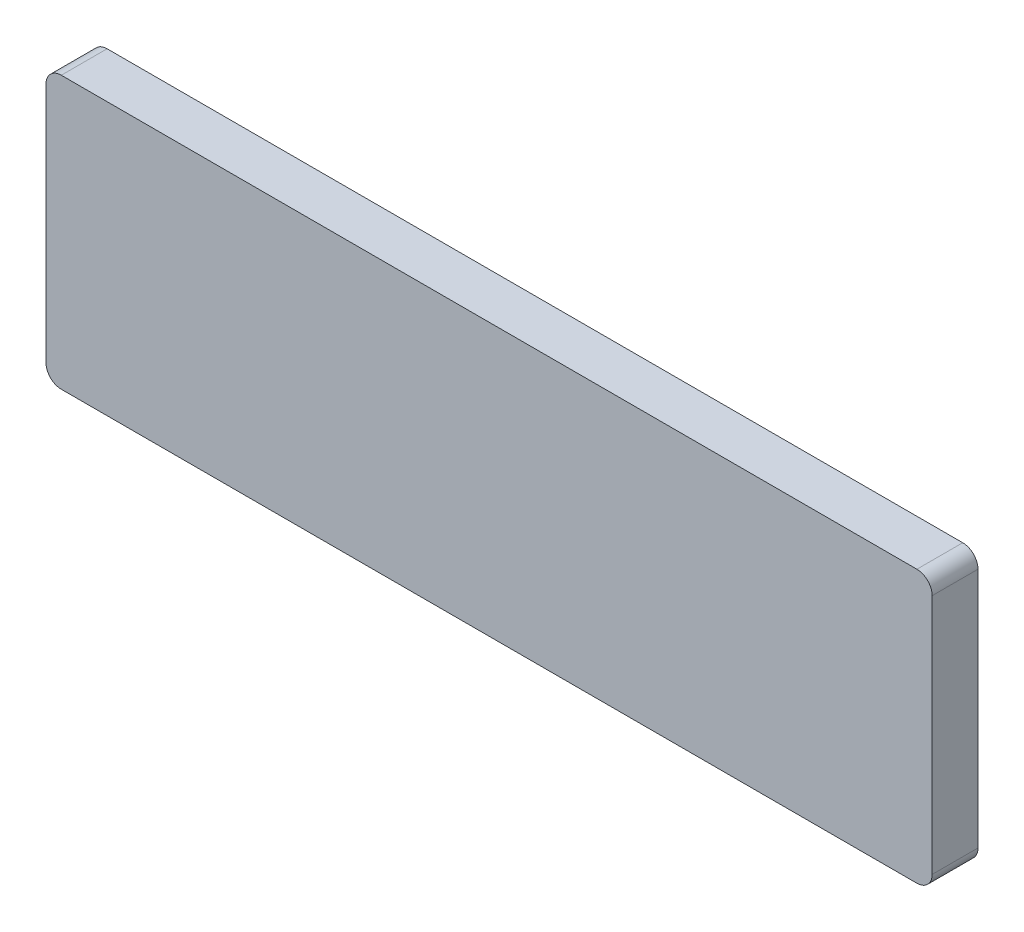
ISO-10303-21;
HEADER;
FILE_DESCRIPTION(('STEP AP214'),'2;1');
FILE_NAME('part.step','',(''),(''),'','','');
FILE_SCHEMA(('AUTOMOTIVE_DESIGN { 1 0 10303 214 1 1 1 1 }'));
ENDSEC;
DATA;
#1=APPLICATION_CONTEXT('core data for automotive mechanical design processes');
#2=APPLICATION_PROTOCOL_DEFINITION('international standard','automotive_design',2000,#1);
#3=PRODUCT_CONTEXT('',#1,'mechanical');
#4=PRODUCT('Part','Part','',(#3));
#5=PRODUCT_RELATED_PRODUCT_CATEGORY('part','',(#4));
#6=PRODUCT_DEFINITION_FORMATION('','',#4);
#7=PRODUCT_DEFINITION_CONTEXT('part definition',#1,'design');
#8=PRODUCT_DEFINITION('design','',#6,#7);
#9=PRODUCT_DEFINITION_SHAPE('','',#8);
#10=(LENGTH_UNIT() NAMED_UNIT(*) SI_UNIT(.MILLI.,.METRE.));
#11=(NAMED_UNIT(*) PLANE_ANGLE_UNIT() SI_UNIT($,.RADIAN.));
#12=(NAMED_UNIT(*) SI_UNIT($,.STERADIAN.) SOLID_ANGLE_UNIT());
#13=UNCERTAINTY_MEASURE_WITH_UNIT(LENGTH_MEASURE(1.E-05),#10,'distance_accuracy_value','');
#14=(GEOMETRIC_REPRESENTATION_CONTEXT(3) GLOBAL_UNCERTAINTY_ASSIGNED_CONTEXT((#13)) GLOBAL_UNIT_ASSIGNED_CONTEXT((#10,
#11,#12)) REPRESENTATION_CONTEXT('',''));
#15=CARTESIAN_POINT('',(0.,0.,0.));
#16=DIRECTION('',(0.,0.,1.));
#17=DIRECTION('',(1.,0.,0.));
#18=AXIS2_PLACEMENT_3D('',#15,#16,#17);
#19=CARTESIAN_POINT('',(140.,39.5,7.5));
#20=DIRECTION('',(0.,0.,-1.));
#21=DIRECTION('',(-1.,0.,0.));
#22=AXIS2_PLACEMENT_3D('',#19,#20,#21);
#23=CYLINDRICAL_SURFACE('',#22,5.);
#24=CARTESIAN_POINT('',(140.,39.5,-7.5));
#25=DIRECTION('',(0.,0.,1.));
#26=DIRECTION('',(-1.,0.,0.));
#27=AXIS2_PLACEMENT_3D('',#24,#25,#26);
#28=CIRCLE('',#27,5.);
#29=CARTESIAN_POINT('',(145.,39.5,-7.5));
#30=VERTEX_POINT('',#29);
#31=CARTESIAN_POINT('',(140.,44.5,-7.5));
#32=VERTEX_POINT('',#31);
#33=EDGE_CURVE('E140',#30,#32,#28,.T.);
#34=ORIENTED_EDGE('',*,*,#33,.T.);
#35=DIRECTION('',(0.,0.,-1.));
#36=VECTOR('',#35,1.);
#37=CARTESIAN_POINT('',(140.,44.5,7.5));
#38=LINE('',#37,#36);
#39=CARTESIAN_POINT('',(140.,44.5,7.5));
#40=VERTEX_POINT('',#39);
#41=EDGE_CURVE('E11',#40,#32,#38,.T.);
#42=ORIENTED_EDGE('',*,*,#41,.F.);
#43=CARTESIAN_POINT('',(140.,39.5,7.5));
#44=DIRECTION('',(0.,0.,1.));
#45=DIRECTION('',(-1.,0.,0.));
#46=AXIS2_PLACEMENT_3D('',#43,#44,#45);
#47=CIRCLE('',#46,5.);
#48=CARTESIAN_POINT('',(145.,39.5,7.5));
#49=VERTEX_POINT('',#48);
#50=EDGE_CURVE('E162',#49,#40,#47,.T.);
#51=ORIENTED_EDGE('',*,*,#50,.F.);
#52=DIRECTION('',(0.,0.,-1.));
#53=VECTOR('',#52,1.);
#54=CARTESIAN_POINT('',(145.,39.5,7.5));
#55=LINE('',#54,#53);
#56=EDGE_CURVE('E136',#49,#30,#55,.T.);
#57=ORIENTED_EDGE('',*,*,#56,.T.);
#58=EDGE_LOOP('',(#34,#42,#51,#57));
#59=FACE_BOUND('',#58,.T.);
#60=ADVANCED_FACE('F39',(#59),#23,.T.);
#61=CARTESIAN_POINT('',(-140.,44.5,7.5));
#62=DIRECTION('',(0.,-1.,0.));
#63=DIRECTION('',(0.,0.,-1.));
#64=AXIS2_PLACEMENT_3D('',#61,#62,#63);
#65=PLANE('',#64);
#66=DIRECTION('',(-1.,0.,0.));
#67=VECTOR('',#66,1.);
#68=CARTESIAN_POINT('',(-140.,44.5,-7.5));
#69=LINE('',#68,#67);
#70=CARTESIAN_POINT('',(-140.,44.5,-7.5));
#71=VERTEX_POINT('',#70);
#72=EDGE_CURVE('E144',#32,#71,#69,.T.);
#73=ORIENTED_EDGE('',*,*,#72,.T.);
#74=DIRECTION('',(0.,0.,-1.));
#75=VECTOR('',#74,1.);
#76=CARTESIAN_POINT('',(-140.,44.5,7.5));
#77=LINE('',#76,#75);
#78=CARTESIAN_POINT('',(-140.,44.5,7.5));
#79=VERTEX_POINT('',#78);
#80=EDGE_CURVE('E48',#79,#71,#77,.T.);
#81=ORIENTED_EDGE('',*,*,#80,.F.);
#82=DIRECTION('',(-1.,0.,0.));
#83=VECTOR('',#82,1.);
#84=CARTESIAN_POINT('',(-140.,44.5,7.5));
#85=LINE('',#84,#83);
#86=EDGE_CURVE('E99',#40,#79,#85,.T.);
#87=ORIENTED_EDGE('',*,*,#86,.F.);
#88=ORIENTED_EDGE('',*,*,#41,.T.);
#89=EDGE_LOOP('',(#73,#81,#87,#88));
#90=FACE_BOUND('',#89,.T.);
#91=ADVANCED_FACE('F208',(#90),#65,.F.);
#92=CARTESIAN_POINT('',(-140.,39.5,7.5));
#93=DIRECTION('',(0.,0.,-1.));
#94=DIRECTION('',(-1.,0.,0.));
#95=AXIS2_PLACEMENT_3D('',#92,#93,#94);
#96=CYLINDRICAL_SURFACE('',#95,5.);
#97=CARTESIAN_POINT('',(-140.,39.5,-7.5));
#98=DIRECTION('',(0.,0.,1.));
#99=DIRECTION('',(1.,0.,0.));
#100=AXIS2_PLACEMENT_3D('',#97,#98,#99);
#101=CIRCLE('',#100,5.);
#102=CARTESIAN_POINT('',(-145.,39.5,-7.5));
#103=VERTEX_POINT('',#102);
#104=EDGE_CURVE('E147',#71,#103,#101,.T.);
#105=ORIENTED_EDGE('',*,*,#104,.T.);
#106=DIRECTION('',(0.,0.,-1.));
#107=VECTOR('',#106,1.);
#108=CARTESIAN_POINT('',(-145.,39.5,7.5));
#109=LINE('',#108,#107);
#110=CARTESIAN_POINT('',(-145.,39.5,7.5));
#111=VERTEX_POINT('',#110);
#112=EDGE_CURVE('E173',#111,#103,#109,.T.);
#113=ORIENTED_EDGE('',*,*,#112,.F.);
#114=CARTESIAN_POINT('',(-140.,39.5,7.5));
#115=DIRECTION('',(0.,0.,1.));
#116=DIRECTION('',(1.,0.,0.));
#117=AXIS2_PLACEMENT_3D('',#114,#115,#116);
#118=CIRCLE('',#117,5.);
#119=EDGE_CURVE('E183',#79,#111,#118,.T.);
#120=ORIENTED_EDGE('',*,*,#119,.F.);
#121=ORIENTED_EDGE('',*,*,#80,.T.);
#122=EDGE_LOOP('',(#105,#113,#120,#121));
#123=FACE_BOUND('',#122,.T.);
#124=ADVANCED_FACE('F181',(#123),#96,.T.);
#125=CARTESIAN_POINT('',(-145.,39.5,7.5));
#126=DIRECTION('',(1.,0.,0.));
#127=DIRECTION('',(0.,0.,-1.));
#128=AXIS2_PLACEMENT_3D('',#125,#126,#127);
#129=PLANE('',#128);
#130=DIRECTION('',(0.,-1.,0.));
#131=VECTOR('',#130,1.);
#132=CARTESIAN_POINT('',(-145.,39.5,-7.5));
#133=LINE('',#132,#131);
#134=CARTESIAN_POINT('',(-145.,-39.5,-7.5));
#135=VERTEX_POINT('',#134);
#136=EDGE_CURVE('E150',#103,#135,#133,.T.);
#137=ORIENTED_EDGE('',*,*,#136,.T.);
#138=DIRECTION('',(0.,0.,-1.));
#139=VECTOR('',#138,1.);
#140=CARTESIAN_POINT('',(-145.,-39.5,7.5));
#141=LINE('',#140,#139);
#142=CARTESIAN_POINT('',(-145.,-39.5,7.5));
#143=VERTEX_POINT('',#142);
#144=EDGE_CURVE('E169',#143,#135,#141,.T.);
#145=ORIENTED_EDGE('',*,*,#144,.F.);
#146=DIRECTION('',(0.,-1.,0.));
#147=VECTOR('',#146,1.);
#148=CARTESIAN_POINT('',(-145.,39.5,7.5));
#149=LINE('',#148,#147);
#150=EDGE_CURVE('E196',#111,#143,#149,.T.);
#151=ORIENTED_EDGE('',*,*,#150,.F.);
#152=ORIENTED_EDGE('',*,*,#112,.T.);
#153=EDGE_LOOP('',(#137,#145,#151,#152));
#154=FACE_BOUND('',#153,.T.);
#155=ADVANCED_FACE('F191',(#154),#129,.F.);
#156=CARTESIAN_POINT('',(-140.,-39.5,7.5));
#157=DIRECTION('',(0.,0.,-1.));
#158=DIRECTION('',(-1.,0.,0.));
#159=AXIS2_PLACEMENT_3D('',#156,#157,#158);
#160=CYLINDRICAL_SURFACE('',#159,5.);
#161=CARTESIAN_POINT('',(-140.,-39.5,-7.5));
#162=DIRECTION('',(0.,0.,1.));
#163=DIRECTION('',(1.,0.,0.));
#164=AXIS2_PLACEMENT_3D('',#161,#162,#163);
#165=CIRCLE('',#164,5.);
#166=CARTESIAN_POINT('',(-140.,-44.5,-7.5));
#167=VERTEX_POINT('',#166);
#168=EDGE_CURVE('E153',#135,#167,#165,.T.);
#169=ORIENTED_EDGE('',*,*,#168,.T.);
#170=DIRECTION('',(0.,0.,-1.));
#171=VECTOR('',#170,1.);
#172=CARTESIAN_POINT('',(-140.,-44.5,7.5));
#173=LINE('',#172,#171);
#174=CARTESIAN_POINT('',(-140.,-44.5,7.5));
#175=VERTEX_POINT('',#174);
#176=EDGE_CURVE('E129',#175,#167,#173,.T.);
#177=ORIENTED_EDGE('',*,*,#176,.F.);
#178=CARTESIAN_POINT('',(-140.,-39.5,7.5));
#179=DIRECTION('',(0.,0.,1.));
#180=DIRECTION('',(1.,0.,0.));
#181=AXIS2_PLACEMENT_3D('',#178,#179,#180);
#182=CIRCLE('',#181,5.);
#183=EDGE_CURVE('E118',#143,#175,#182,.T.);
#184=ORIENTED_EDGE('',*,*,#183,.F.);
#185=ORIENTED_EDGE('',*,*,#144,.T.);
#186=EDGE_LOOP('',(#169,#177,#184,#185));
#187=FACE_BOUND('',#186,.T.);
#188=ADVANCED_FACE('F194',(#187),#160,.T.);
#189=CARTESIAN_POINT('',(-140.,-44.5,7.5));
#190=DIRECTION('',(0.,1.,0.));
#191=DIRECTION('',(0.,0.,1.));
#192=AXIS2_PLACEMENT_3D('',#189,#190,#191);
#193=PLANE('',#192);
#194=DIRECTION('',(1.,0.,0.));
#195=VECTOR('',#194,1.);
#196=CARTESIAN_POINT('',(-140.,-44.5,-7.5));
#197=LINE('',#196,#195);
#198=CARTESIAN_POINT('',(140.,-44.5,-7.5));
#199=VERTEX_POINT('',#198);
#200=EDGE_CURVE('E127',#167,#199,#197,.T.);
#201=ORIENTED_EDGE('',*,*,#200,.T.);
#202=DIRECTION('',(0.,0.,-1.));
#203=VECTOR('',#202,1.);
#204=CARTESIAN_POINT('',(140.,-44.5,7.5));
#205=LINE('',#204,#203);
#206=CARTESIAN_POINT('',(140.,-44.5,7.5));
#207=VERTEX_POINT('',#206);
#208=EDGE_CURVE('E124',#207,#199,#205,.T.);
#209=ORIENTED_EDGE('',*,*,#208,.F.);
#210=DIRECTION('',(1.,0.,0.));
#211=VECTOR('',#210,1.);
#212=CARTESIAN_POINT('',(-140.,-44.5,7.5));
#213=LINE('',#212,#211);
#214=EDGE_CURVE('E112',#175,#207,#213,.T.);
#215=ORIENTED_EDGE('',*,*,#214,.F.);
#216=ORIENTED_EDGE('',*,*,#176,.T.);
#217=EDGE_LOOP('',(#201,#209,#215,#216));
#218=FACE_BOUND('',#217,.T.);
#219=ADVANCED_FACE('F125',(#218),#193,.F.);
#220=CARTESIAN_POINT('',(140.,-39.5,7.5));
#221=DIRECTION('',(0.,0.,-1.));
#222=DIRECTION('',(-1.,0.,0.));
#223=AXIS2_PLACEMENT_3D('',#220,#221,#222);
#224=CYLINDRICAL_SURFACE('',#223,5.);
#225=CARTESIAN_POINT('',(140.,-39.5,-7.5));
#226=DIRECTION('',(0.,0.,1.));
#227=DIRECTION('',(1.,0.,0.));
#228=AXIS2_PLACEMENT_3D('',#225,#226,#227);
#229=CIRCLE('',#228,5.);
#230=CARTESIAN_POINT('',(145.,-39.5,-7.5));
#231=VERTEX_POINT('',#230);
#232=EDGE_CURVE('E85',#199,#231,#229,.T.);
#233=ORIENTED_EDGE('',*,*,#232,.T.);
#234=DIRECTION('',(0.,0.,-1.));
#235=VECTOR('',#234,1.);
#236=CARTESIAN_POINT('',(145.,-39.5,7.5));
#237=LINE('',#236,#235);
#238=CARTESIAN_POINT('',(145.,-39.5,7.5));
#239=VERTEX_POINT('',#238);
#240=EDGE_CURVE('E130',#239,#231,#237,.T.);
#241=ORIENTED_EDGE('',*,*,#240,.F.);
#242=CARTESIAN_POINT('',(140.,-39.5,7.5));
#243=DIRECTION('',(0.,0.,1.));
#244=DIRECTION('',(1.,0.,0.));
#245=AXIS2_PLACEMENT_3D('',#242,#243,#244);
#246=CIRCLE('',#245,5.);
#247=EDGE_CURVE('E116',#207,#239,#246,.T.);
#248=ORIENTED_EDGE('',*,*,#247,.F.);
#249=ORIENTED_EDGE('',*,*,#208,.T.);
#250=EDGE_LOOP('',(#233,#241,#248,#249));
#251=FACE_BOUND('',#250,.T.);
#252=ADVANCED_FACE('F132',(#251),#224,.T.);
#253=CARTESIAN_POINT('',(145.,39.5,7.5));
#254=DIRECTION('',(-1.,0.,0.));
#255=DIRECTION('',(0.,0.,1.));
#256=AXIS2_PLACEMENT_3D('',#253,#254,#255);
#257=PLANE('',#256);
#258=DIRECTION('',(0.,1.,0.));
#259=VECTOR('',#258,1.);
#260=CARTESIAN_POINT('',(145.,39.5,-7.5));
#261=LINE('',#260,#259);
#262=EDGE_CURVE('E91',#231,#30,#261,.T.);
#263=ORIENTED_EDGE('',*,*,#262,.T.);
#264=ORIENTED_EDGE('',*,*,#56,.F.);
#265=DIRECTION('',(0.,1.,0.));
#266=VECTOR('',#265,1.);
#267=CARTESIAN_POINT('',(145.,39.5,7.5));
#268=LINE('',#267,#266);
#269=EDGE_CURVE('E56',#239,#49,#268,.T.);
#270=ORIENTED_EDGE('',*,*,#269,.F.);
#271=ORIENTED_EDGE('',*,*,#240,.T.);
#272=EDGE_LOOP('',(#263,#264,#270,#271));
#273=FACE_BOUND('',#272,.T.);
#274=ADVANCED_FACE('F224',(#273),#257,.F.);
#275=CARTESIAN_POINT('',(140.,39.5,7.5));
#276=DIRECTION('',(0.,0.,-1.));
#277=DIRECTION('',(-1.,0.,0.));
#278=AXIS2_PLACEMENT_3D('',#275,#276,#277);
#279=PLANE('',#278);
#280=ORIENTED_EDGE('',*,*,#50,.T.);
#281=ORIENTED_EDGE('',*,*,#86,.T.);
#282=ORIENTED_EDGE('',*,*,#119,.T.);
#283=ORIENTED_EDGE('',*,*,#150,.T.);
#284=ORIENTED_EDGE('',*,*,#183,.T.);
#285=ORIENTED_EDGE('',*,*,#214,.T.);
#286=ORIENTED_EDGE('',*,*,#247,.T.);
#287=ORIENTED_EDGE('',*,*,#269,.T.);
#288=EDGE_LOOP('',(#280,#281,#282,#283,#284,#285,#286,#287));
#289=FACE_BOUND('',#288,.T.);
#290=ADVANCED_FACE('F114',(#289),#279,.F.);
#291=CARTESIAN_POINT('',(140.,39.5,-7.5));
#292=DIRECTION('',(0.,0.,-1.));
#293=DIRECTION('',(-1.,0.,0.));
#294=AXIS2_PLACEMENT_3D('',#291,#292,#293);
#295=PLANE('',#294);
#296=ORIENTED_EDGE('',*,*,#33,.F.);
#297=ORIENTED_EDGE('',*,*,#262,.F.);
#298=ORIENTED_EDGE('',*,*,#232,.F.);
#299=ORIENTED_EDGE('',*,*,#200,.F.);
#300=ORIENTED_EDGE('',*,*,#168,.F.);
#301=ORIENTED_EDGE('',*,*,#136,.F.);
#302=ORIENTED_EDGE('',*,*,#104,.F.);
#303=ORIENTED_EDGE('',*,*,#72,.F.);
#304=EDGE_LOOP('',(#296,#297,#298,#299,#300,#301,#302,#303));
#305=FACE_BOUND('',#304,.T.);
#306=ADVANCED_FACE('F187',(#305),#295,.T.);
#307=CLOSED_SHELL('',(#60,#91,#124,#155,#188,#219,#252,#274,#290,#306));
#308=MANIFOLD_SOLID_BREP('B2',#307);
#309=ADVANCED_BREP_SHAPE_REPRESENTATION('',(#18,#308),#14);
#310=SHAPE_DEFINITION_REPRESENTATION(#9,#309);
ENDSEC;
END-ISO-10303-21;
